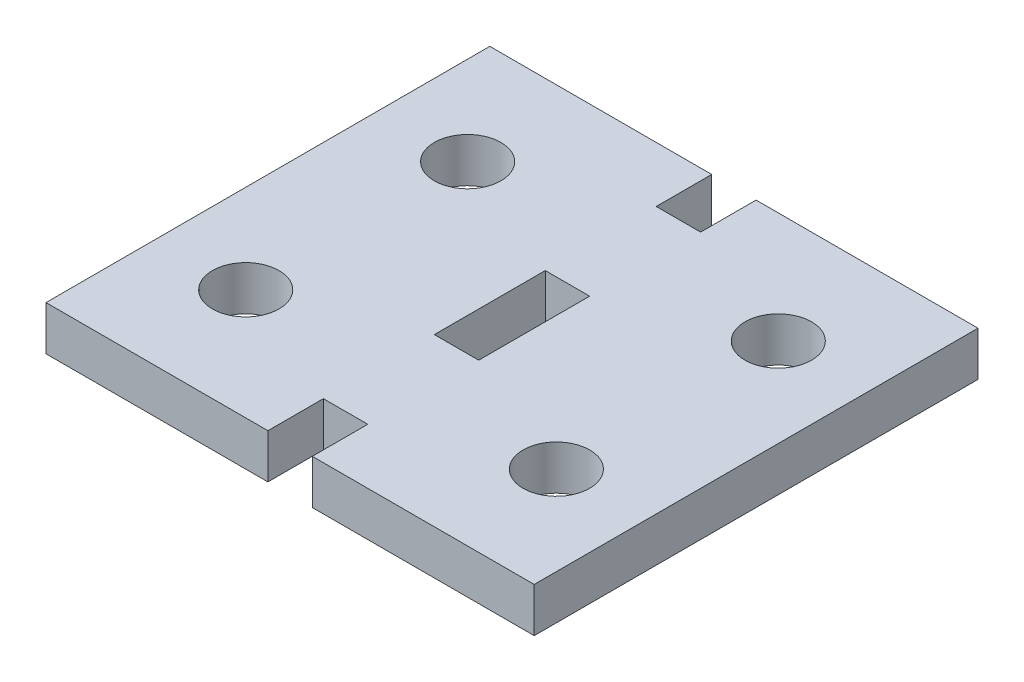
ISO-10303-21;
HEADER;
FILE_DESCRIPTION(('STEP AP214'),'2;1');
FILE_NAME('part.step','',(''),(''),'','','');
FILE_SCHEMA(('AUTOMOTIVE_DESIGN { 1 0 10303 214 1 1 1 1 }'));
ENDSEC;
DATA;
#1=APPLICATION_CONTEXT('core data for automotive mechanical design processes');
#2=APPLICATION_PROTOCOL_DEFINITION('international standard','automotive_design',2000,#1);
#3=PRODUCT_CONTEXT('',#1,'mechanical');
#4=PRODUCT('Part','Part','',(#3));
#5=PRODUCT_RELATED_PRODUCT_CATEGORY('part','',(#4));
#6=PRODUCT_DEFINITION_FORMATION('','',#4);
#7=PRODUCT_DEFINITION_CONTEXT('part definition',#1,'design');
#8=PRODUCT_DEFINITION('design','',#6,#7);
#9=PRODUCT_DEFINITION_SHAPE('','',#8);
#10=(LENGTH_UNIT() NAMED_UNIT(*) SI_UNIT(.MILLI.,.METRE.));
#11=(NAMED_UNIT(*) PLANE_ANGLE_UNIT() SI_UNIT($,.RADIAN.));
#12=(NAMED_UNIT(*) SI_UNIT($,.STERADIAN.) SOLID_ANGLE_UNIT());
#13=UNCERTAINTY_MEASURE_WITH_UNIT(LENGTH_MEASURE(1.E-05),#10,'distance_accuracy_value','');
#14=(GEOMETRIC_REPRESENTATION_CONTEXT(3) GLOBAL_UNCERTAINTY_ASSIGNED_CONTEXT((#13)) GLOBAL_UNIT_ASSIGNED_CONTEXT((#10,
#11,#12)) REPRESENTATION_CONTEXT('',''));
#15=CARTESIAN_POINT('',(0.,0.,0.));
#16=DIRECTION('',(0.,0.,1.));
#17=DIRECTION('',(1.,0.,0.));
#18=AXIS2_PLACEMENT_3D('',#15,#16,#17);
#19=CARTESIAN_POINT('',(-11.,2.,-10.));
#20=DIRECTION('',(0.,0.,1.));
#21=DIRECTION('',(1.,0.,0.));
#22=AXIS2_PLACEMENT_3D('',#19,#20,#21);
#23=PLANE('',#22);
#24=DIRECTION('',(-1.,0.,0.));
#25=VECTOR('',#24,1.);
#26=CARTESIAN_POINT('',(-11.,2.,-10.));
#27=LINE('',#26,#25);
#28=CARTESIAN_POINT('',(-1.,2.,-10.));
#29=VERTEX_POINT('',#28);
#30=CARTESIAN_POINT('',(-11.,2.,-10.));
#31=VERTEX_POINT('',#30);
#32=EDGE_CURVE('E253',#29,#31,#27,.T.);
#33=ORIENTED_EDGE('',*,*,#32,.F.);
#34=DIRECTION('',(0.,1.,0.));
#35=VECTOR('',#34,1.);
#36=CARTESIAN_POINT('',(-1.,0.,-10.));
#37=LINE('',#36,#35);
#38=CARTESIAN_POINT('',(-1.,0.,-10.));
#39=VERTEX_POINT('',#38);
#40=EDGE_CURVE('E181',#39,#29,#37,.T.);
#41=ORIENTED_EDGE('',*,*,#40,.F.);
#42=DIRECTION('',(-1.,0.,0.));
#43=VECTOR('',#42,1.);
#44=CARTESIAN_POINT('',(-11.,0.,-10.));
#45=LINE('',#44,#43);
#46=CARTESIAN_POINT('',(-11.,0.,-10.));
#47=VERTEX_POINT('',#46);
#48=EDGE_CURVE('E168',#39,#47,#45,.T.);
#49=ORIENTED_EDGE('',*,*,#48,.T.);
#50=DIRECTION('',(0.,-1.,0.));
#51=VECTOR('',#50,1.);
#52=CARTESIAN_POINT('',(-11.,2.,-10.));
#53=LINE('',#52,#51);
#54=EDGE_CURVE('E41',#31,#47,#53,.T.);
#55=ORIENTED_EDGE('',*,*,#54,.F.);
#56=EDGE_LOOP('',(#33,#41,#49,#55));
#57=FACE_BOUND('',#56,.T.);
#58=ADVANCED_FACE('F33',(#57),#23,.F.);
#59=CARTESIAN_POINT('',(-11.,2.,10.));
#60=DIRECTION('',(0.,0.,-1.));
#61=DIRECTION('',(-1.,0.,0.));
#62=AXIS2_PLACEMENT_3D('',#59,#60,#61);
#63=PLANE('',#62);
#64=DIRECTION('',(1.,0.,0.));
#65=VECTOR('',#64,1.);
#66=CARTESIAN_POINT('',(-11.,2.,10.));
#67=LINE('',#66,#65);
#68=CARTESIAN_POINT('',(1.,2.,10.));
#69=VERTEX_POINT('',#68);
#70=CARTESIAN_POINT('',(11.,2.,10.));
#71=VERTEX_POINT('',#70);
#72=EDGE_CURVE('E260',#69,#71,#67,.T.);
#73=ORIENTED_EDGE('',*,*,#72,.F.);
#74=DIRECTION('',(0.,1.,0.));
#75=VECTOR('',#74,1.);
#76=CARTESIAN_POINT('',(1.,0.,10.));
#77=LINE('',#76,#75);
#78=CARTESIAN_POINT('',(1.,0.,10.));
#79=VERTEX_POINT('',#78);
#80=EDGE_CURVE('E179',#79,#69,#77,.T.);
#81=ORIENTED_EDGE('',*,*,#80,.F.);
#82=DIRECTION('',(1.,0.,0.));
#83=VECTOR('',#82,1.);
#84=CARTESIAN_POINT('',(-11.,0.,10.));
#85=LINE('',#84,#83);
#86=CARTESIAN_POINT('',(11.,0.,10.));
#87=VERTEX_POINT('',#86);
#88=EDGE_CURVE('E272',#79,#87,#85,.T.);
#89=ORIENTED_EDGE('',*,*,#88,.T.);
#90=DIRECTION('',(0.,-1.,0.));
#91=VECTOR('',#90,1.);
#92=CARTESIAN_POINT('',(11.,2.,10.));
#93=LINE('',#92,#91);
#94=EDGE_CURVE('E264',#71,#87,#93,.T.);
#95=ORIENTED_EDGE('',*,*,#94,.F.);
#96=EDGE_LOOP('',(#73,#81,#89,#95));
#97=FACE_BOUND('',#96,.T.);
#98=ADVANCED_FACE('F298',(#97),#63,.F.);
#99=CARTESIAN_POINT('',(11.,2.,-10.));
#100=DIRECTION('',(-1.,0.,0.));
#101=DIRECTION('',(0.,0.,1.));
#102=AXIS2_PLACEMENT_3D('',#99,#100,#101);
#103=PLANE('',#102);
#104=DIRECTION('',(0.,0.,-1.));
#105=VECTOR('',#104,1.);
#106=CARTESIAN_POINT('',(11.,0.,-10.));
#107=LINE('',#106,#105);
#108=CARTESIAN_POINT('',(11.,0.,-10.));
#109=VERTEX_POINT('',#108);
#110=EDGE_CURVE('E243',#87,#109,#107,.T.);
#111=ORIENTED_EDGE('',*,*,#110,.T.);
#112=DIRECTION('',(0.,-1.,0.));
#113=VECTOR('',#112,1.);
#114=CARTESIAN_POINT('',(11.,2.,-10.));
#115=LINE('',#114,#113);
#116=CARTESIAN_POINT('',(11.,2.,-10.));
#117=VERTEX_POINT('',#116);
#118=EDGE_CURVE('E11',#117,#109,#115,.T.);
#119=ORIENTED_EDGE('',*,*,#118,.F.);
#120=DIRECTION('',(0.,0.,-1.));
#121=VECTOR('',#120,1.);
#122=CARTESIAN_POINT('',(11.,2.,-10.));
#123=LINE('',#122,#121);
#124=EDGE_CURVE('E250',#71,#117,#123,.T.);
#125=ORIENTED_EDGE('',*,*,#124,.F.);
#126=ORIENTED_EDGE('',*,*,#94,.T.);
#127=EDGE_LOOP('',(#111,#119,#125,#126));
#128=FACE_BOUND('',#127,.T.);
#129=ADVANCED_FACE('F35',(#128),#103,.F.);
#130=CARTESIAN_POINT('',(0.999999999999999,0.,-10.));
#131=VERTEX_POINT('',#130);
#132=EDGE_CURVE('E267',#109,#131,#45,.T.);
#133=ORIENTED_EDGE('',*,*,#132,.T.);
#134=DIRECTION('',(0.,1.,0.));
#135=VECTOR('',#134,1.);
#136=CARTESIAN_POINT('',(0.999999999999999,0.,-10.));
#137=LINE('',#136,#135);
#138=CARTESIAN_POINT('',(0.999999999999999,2.,-10.));
#139=VERTEX_POINT('',#138);
#140=EDGE_CURVE('E184',#131,#139,#137,.T.);
#141=ORIENTED_EDGE('',*,*,#140,.T.);
#142=EDGE_CURVE('E255',#117,#139,#27,.T.);
#143=ORIENTED_EDGE('',*,*,#142,.F.);
#144=ORIENTED_EDGE('',*,*,#118,.T.);
#145=EDGE_LOOP('',(#133,#141,#143,#144));
#146=FACE_BOUND('',#145,.T.);
#147=ADVANCED_FACE('F299',(#146),#23,.F.);
#148=CARTESIAN_POINT('',(-11.,2.,-10.));
#149=DIRECTION('',(1.,0.,0.));
#150=DIRECTION('',(0.,0.,-1.));
#151=AXIS2_PLACEMENT_3D('',#148,#149,#150);
#152=PLANE('',#151);
#153=DIRECTION('',(0.,0.,1.));
#154=VECTOR('',#153,1.);
#155=CARTESIAN_POINT('',(-11.,0.,-10.));
#156=LINE('',#155,#154);
#157=CARTESIAN_POINT('',(-11.,0.,10.));
#158=VERTEX_POINT('',#157);
#159=EDGE_CURVE('E270',#47,#158,#156,.T.);
#160=ORIENTED_EDGE('',*,*,#159,.T.);
#161=DIRECTION('',(0.,-1.,0.));
#162=VECTOR('',#161,1.);
#163=CARTESIAN_POINT('',(-11.,2.,10.));
#164=LINE('',#163,#162);
#165=CARTESIAN_POINT('',(-11.,2.,10.));
#166=VERTEX_POINT('',#165);
#167=EDGE_CURVE('E277',#166,#158,#164,.T.);
#168=ORIENTED_EDGE('',*,*,#167,.F.);
#169=DIRECTION('',(0.,0.,1.));
#170=VECTOR('',#169,1.);
#171=CARTESIAN_POINT('',(-11.,2.,-10.));
#172=LINE('',#171,#170);
#173=EDGE_CURVE('E258',#31,#166,#172,.T.);
#174=ORIENTED_EDGE('',*,*,#173,.F.);
#175=ORIENTED_EDGE('',*,*,#54,.T.);
#176=EDGE_LOOP('',(#160,#168,#174,#175));
#177=FACE_BOUND('',#176,.T.);
#178=ADVANCED_FACE('F283',(#177),#152,.F.);
#179=CARTESIAN_POINT('',(-0.999999999999998,0.,10.));
#180=VERTEX_POINT('',#179);
#181=EDGE_CURVE('E254',#158,#180,#85,.T.);
#182=ORIENTED_EDGE('',*,*,#181,.T.);
#183=DIRECTION('',(0.,1.,0.));
#184=VECTOR('',#183,1.);
#185=CARTESIAN_POINT('',(-0.999999999999998,0.,10.));
#186=LINE('',#185,#184);
#187=CARTESIAN_POINT('',(-0.999999999999998,2.,10.));
#188=VERTEX_POINT('',#187);
#189=EDGE_CURVE('E206',#180,#188,#186,.T.);
#190=ORIENTED_EDGE('',*,*,#189,.T.);
#191=EDGE_CURVE('E261',#166,#188,#67,.T.);
#192=ORIENTED_EDGE('',*,*,#191,.F.);
#193=ORIENTED_EDGE('',*,*,#167,.T.);
#194=EDGE_LOOP('',(#182,#190,#192,#193));
#195=FACE_BOUND('',#194,.T.);
#196=ADVANCED_FACE('F289',(#195),#63,.F.);
#197=CARTESIAN_POINT('',(0.,2.,0.));
#198=DIRECTION('',(0.,1.,0.));
#199=DIRECTION('',(0.,0.,1.));
#200=AXIS2_PLACEMENT_3D('',#197,#198,#199);
#201=PLANE('',#200);
#202=CARTESIAN_POINT('',(7.,2.,5.));
#203=DIRECTION('',(0.,1.,0.));
#204=DIRECTION('',(0.,0.,1.));
#205=AXIS2_PLACEMENT_3D('',#202,#203,#204);
#206=CIRCLE('',#205,1.5);
#207=CARTESIAN_POINT('',(7.,2.,6.5));
#208=VERTEX_POINT('',#207);
#209=EDGE_CURVE('E174',#208,#208,#206,.T.);
#210=ORIENTED_EDGE('',*,*,#209,.F.);
#211=EDGE_LOOP('',(#210));
#212=FACE_BOUND('',#211,.T.);
#213=CARTESIAN_POINT('',(7.,2.,-5.));
#214=DIRECTION('',(0.,1.,0.));
#215=DIRECTION('',(0.,0.,1.));
#216=AXIS2_PLACEMENT_3D('',#213,#214,#215);
#217=CIRCLE('',#216,1.5);
#218=CARTESIAN_POINT('',(7.,2.,-3.5));
#219=VERTEX_POINT('',#218);
#220=EDGE_CURVE('E467',#219,#219,#217,.T.);
#221=ORIENTED_EDGE('',*,*,#220,.F.);
#222=EDGE_LOOP('',(#221));
#223=FACE_BOUND('',#222,.T.);
#224=CARTESIAN_POINT('',(-7.,2.,5.));
#225=DIRECTION('',(0.,1.,0.));
#226=DIRECTION('',(0.,0.,1.));
#227=AXIS2_PLACEMENT_3D('',#224,#225,#226);
#228=CIRCLE('',#227,1.5);
#229=CARTESIAN_POINT('',(-7.,2.,6.5));
#230=VERTEX_POINT('',#229);
#231=EDGE_CURVE('E474',#230,#230,#228,.T.);
#232=ORIENTED_EDGE('',*,*,#231,.F.);
#233=EDGE_LOOP('',(#232));
#234=FACE_BOUND('',#233,.T.);
#235=CARTESIAN_POINT('',(-7.,2.,-5.));
#236=DIRECTION('',(0.,1.,0.));
#237=DIRECTION('',(0.,0.,1.));
#238=AXIS2_PLACEMENT_3D('',#235,#236,#237);
#239=CIRCLE('',#238,1.5);
#240=CARTESIAN_POINT('',(-7.,2.,-3.5));
#241=VERTEX_POINT('',#240);
#242=EDGE_CURVE('E214',#241,#241,#239,.T.);
#243=ORIENTED_EDGE('',*,*,#242,.F.);
#244=EDGE_LOOP('',(#243));
#245=FACE_BOUND('',#244,.T.);
#246=DIRECTION('',(0.,0.,-1.));
#247=VECTOR('',#246,1.);
#248=CARTESIAN_POINT('',(1.,2.,10.));
#249=LINE('',#248,#247);
#250=CARTESIAN_POINT('',(1.,2.,7.5));
#251=VERTEX_POINT('',#250);
#252=EDGE_CURVE('E197',#69,#251,#249,.T.);
#253=ORIENTED_EDGE('',*,*,#252,.F.);
#254=ORIENTED_EDGE('',*,*,#72,.T.);
#255=ORIENTED_EDGE('',*,*,#124,.T.);
#256=ORIENTED_EDGE('',*,*,#142,.T.);
#257=DIRECTION('',(0.,0.,-1.));
#258=VECTOR('',#257,1.);
#259=CARTESIAN_POINT('',(0.999999999999999,2.,-10.));
#260=LINE('',#259,#258);
#261=CARTESIAN_POINT('',(0.999999999999999,2.,-7.5));
#262=VERTEX_POINT('',#261);
#263=EDGE_CURVE('E169',#262,#139,#260,.T.);
#264=ORIENTED_EDGE('',*,*,#263,.F.);
#265=DIRECTION('',(1.,0.,0.));
#266=VECTOR('',#265,1.);
#267=CARTESIAN_POINT('',(-1.,2.,-7.5));
#268=LINE('',#267,#266);
#269=CARTESIAN_POINT('',(-1.,2.,-7.5));
#270=VERTEX_POINT('',#269);
#271=EDGE_CURVE('E171',#270,#262,#268,.T.);
#272=ORIENTED_EDGE('',*,*,#271,.F.);
#273=DIRECTION('',(0.,0.,1.));
#274=VECTOR('',#273,1.);
#275=CARTESIAN_POINT('',(-1.,2.,-7.5));
#276=LINE('',#275,#274);
#277=EDGE_CURVE('E152',#29,#270,#276,.T.);
#278=ORIENTED_EDGE('',*,*,#277,.F.);
#279=ORIENTED_EDGE('',*,*,#32,.T.);
#280=ORIENTED_EDGE('',*,*,#173,.T.);
#281=ORIENTED_EDGE('',*,*,#191,.T.);
#282=DIRECTION('',(0.,0.,1.));
#283=VECTOR('',#282,1.);
#284=CARTESIAN_POINT('',(-0.999999999999998,2.,7.5));
#285=LINE('',#284,#283);
#286=CARTESIAN_POINT('',(-0.999999999999998,2.,7.5));
#287=VERTEX_POINT('',#286);
#288=EDGE_CURVE('E192',#287,#188,#285,.T.);
#289=ORIENTED_EDGE('',*,*,#288,.F.);
#290=DIRECTION('',(-1.,0.,0.));
#291=VECTOR('',#290,1.);
#292=CARTESIAN_POINT('',(-0.999999999999998,2.,7.5));
#293=LINE('',#292,#291);
#294=EDGE_CURVE('E200',#251,#287,#293,.T.);
#295=ORIENTED_EDGE('',*,*,#294,.F.);
#296=EDGE_LOOP('',(#253,#254,#255,#256,#264,#272,#278,#279,#280,#281,#289,#295));
#297=FACE_BOUND('',#296,.T.);
#298=DIRECTION('',(0.,0.,-1.));
#299=VECTOR('',#298,1.);
#300=CARTESIAN_POINT('',(1.,2.,-2.5));
#301=LINE('',#300,#299);
#302=CARTESIAN_POINT('',(1.,2.,2.5));
#303=VERTEX_POINT('',#302);
#304=CARTESIAN_POINT('',(1.,2.,-2.5));
#305=VERTEX_POINT('',#304);
#306=EDGE_CURVE('E183',#303,#305,#301,.T.);
#307=ORIENTED_EDGE('',*,*,#306,.F.);
#308=DIRECTION('',(1.,0.,0.));
#309=VECTOR('',#308,1.);
#310=CARTESIAN_POINT('',(-0.999999999999999,2.,2.5));
#311=LINE('',#310,#309);
#312=CARTESIAN_POINT('',(-0.999999999999999,2.,2.5));
#313=VERTEX_POINT('',#312);
#314=EDGE_CURVE('E222',#313,#303,#311,.T.);
#315=ORIENTED_EDGE('',*,*,#314,.F.);
#316=DIRECTION('',(0.,0.,1.));
#317=VECTOR('',#316,1.);
#318=CARTESIAN_POINT('',(-1.,2.,-2.5));
#319=LINE('',#318,#317);
#320=CARTESIAN_POINT('',(-1.,2.,-2.5));
#321=VERTEX_POINT('',#320);
#322=EDGE_CURVE('E236',#321,#313,#319,.T.);
#323=ORIENTED_EDGE('',*,*,#322,.F.);
#324=DIRECTION('',(-1.,0.,0.));
#325=VECTOR('',#324,1.);
#326=CARTESIAN_POINT('',(-1.,2.,-2.5));
#327=LINE('',#326,#325);
#328=EDGE_CURVE('E233',#305,#321,#327,.T.);
#329=ORIENTED_EDGE('',*,*,#328,.F.);
#330=EDGE_LOOP('',(#307,#315,#323,#329));
#331=FACE_BOUND('',#330,.T.);
#332=ADVANCED_FACE('F294',(#212,#223,#234,#245,#297,#331),#201,.T.);
#333=CARTESIAN_POINT('',(0.,0.,0.));
#334=DIRECTION('',(0.,1.,0.));
#335=DIRECTION('',(0.,0.,1.));
#336=AXIS2_PLACEMENT_3D('',#333,#334,#335);
#337=PLANE('',#336);
#338=CARTESIAN_POINT('',(7.,0.,5.));
#339=DIRECTION('',(0.,1.,0.));
#340=DIRECTION('',(0.,0.,1.));
#341=AXIS2_PLACEMENT_3D('',#338,#339,#340);
#342=CIRCLE('',#341,1.5);
#343=CARTESIAN_POINT('',(7.,0.,6.5));
#344=VERTEX_POINT('',#343);
#345=EDGE_CURVE('E464',#344,#344,#342,.T.);
#346=ORIENTED_EDGE('',*,*,#345,.T.);
#347=EDGE_LOOP('',(#346));
#348=FACE_BOUND('',#347,.T.);
#349=CARTESIAN_POINT('',(7.,0.,-5.));
#350=DIRECTION('',(0.,1.,0.));
#351=DIRECTION('',(0.,0.,1.));
#352=AXIS2_PLACEMENT_3D('',#349,#350,#351);
#353=CIRCLE('',#352,1.5);
#354=CARTESIAN_POINT('',(7.,0.,-3.5));
#355=VERTEX_POINT('',#354);
#356=EDGE_CURVE('E469',#355,#355,#353,.T.);
#357=ORIENTED_EDGE('',*,*,#356,.T.);
#358=EDGE_LOOP('',(#357));
#359=FACE_BOUND('',#358,.T.);
#360=CARTESIAN_POINT('',(-7.,0.,5.));
#361=DIRECTION('',(0.,1.,0.));
#362=DIRECTION('',(0.,0.,1.));
#363=AXIS2_PLACEMENT_3D('',#360,#361,#362);
#364=CIRCLE('',#363,1.5);
#365=CARTESIAN_POINT('',(-7.,0.,6.5));
#366=VERTEX_POINT('',#365);
#367=EDGE_CURVE('E217',#366,#366,#364,.T.);
#368=ORIENTED_EDGE('',*,*,#367,.T.);
#369=EDGE_LOOP('',(#368));
#370=FACE_BOUND('',#369,.T.);
#371=CARTESIAN_POINT('',(-7.,0.,-5.));
#372=DIRECTION('',(0.,1.,0.));
#373=DIRECTION('',(0.,0.,1.));
#374=AXIS2_PLACEMENT_3D('',#371,#372,#373);
#375=CIRCLE('',#374,1.5);
#376=CARTESIAN_POINT('',(-7.,0.,-3.5));
#377=VERTEX_POINT('',#376);
#378=EDGE_CURVE('E201',#377,#377,#375,.T.);
#379=ORIENTED_EDGE('',*,*,#378,.T.);
#380=EDGE_LOOP('',(#379));
#381=FACE_BOUND('',#380,.T.);
#382=ORIENTED_EDGE('',*,*,#88,.F.);
#383=DIRECTION('',(0.,0.,-1.));
#384=VECTOR('',#383,1.);
#385=CARTESIAN_POINT('',(1.,0.,10.));
#386=LINE('',#385,#384);
#387=CARTESIAN_POINT('',(1.,0.,7.5));
#388=VERTEX_POINT('',#387);
#389=EDGE_CURVE('E188',#79,#388,#386,.T.);
#390=ORIENTED_EDGE('',*,*,#389,.T.);
#391=DIRECTION('',(-1.,0.,0.));
#392=VECTOR('',#391,1.);
#393=CARTESIAN_POINT('',(-0.999999999999998,0.,7.5));
#394=LINE('',#393,#392);
#395=CARTESIAN_POINT('',(-0.999999999999998,0.,7.5));
#396=VERTEX_POINT('',#395);
#397=EDGE_CURVE('E191',#388,#396,#394,.T.);
#398=ORIENTED_EDGE('',*,*,#397,.T.);
#399=DIRECTION('',(0.,0.,1.));
#400=VECTOR('',#399,1.);
#401=CARTESIAN_POINT('',(-0.999999999999998,0.,7.5));
#402=LINE('',#401,#400);
#403=EDGE_CURVE('E48',#396,#180,#402,.T.);
#404=ORIENTED_EDGE('',*,*,#403,.T.);
#405=ORIENTED_EDGE('',*,*,#181,.F.);
#406=ORIENTED_EDGE('',*,*,#159,.F.);
#407=ORIENTED_EDGE('',*,*,#48,.F.);
#408=DIRECTION('',(0.,0.,1.));
#409=VECTOR('',#408,1.);
#410=CARTESIAN_POINT('',(-1.,0.,-7.5));
#411=LINE('',#410,#409);
#412=CARTESIAN_POINT('',(-1.,0.,-7.5));
#413=VERTEX_POINT('',#412);
#414=EDGE_CURVE('E149',#39,#413,#411,.T.);
#415=ORIENTED_EDGE('',*,*,#414,.T.);
#416=DIRECTION('',(1.,0.,0.));
#417=VECTOR('',#416,1.);
#418=CARTESIAN_POINT('',(-1.,0.,-7.5));
#419=LINE('',#418,#417);
#420=CARTESIAN_POINT('',(0.999999999999999,0.,-7.5));
#421=VERTEX_POINT('',#420);
#422=EDGE_CURVE('E159',#413,#421,#419,.T.);
#423=ORIENTED_EDGE('',*,*,#422,.T.);
#424=DIRECTION('',(0.,0.,-1.));
#425=VECTOR('',#424,1.);
#426=CARTESIAN_POINT('',(0.999999999999999,0.,-10.));
#427=LINE('',#426,#425);
#428=EDGE_CURVE('E56',#421,#131,#427,.T.);
#429=ORIENTED_EDGE('',*,*,#428,.T.);
#430=ORIENTED_EDGE('',*,*,#132,.F.);
#431=ORIENTED_EDGE('',*,*,#110,.F.);
#432=EDGE_LOOP('',(#382,#390,#398,#404,#405,#406,#407,#415,#423,#429,#430,#431));
#433=FACE_BOUND('',#432,.T.);
#434=DIRECTION('',(1.,0.,0.));
#435=VECTOR('',#434,1.);
#436=CARTESIAN_POINT('',(-0.999999999999999,0.,2.5));
#437=LINE('',#436,#435);
#438=CARTESIAN_POINT('',(-0.999999999999999,0.,2.5));
#439=VERTEX_POINT('',#438);
#440=CARTESIAN_POINT('',(1.,0.,2.5));
#441=VERTEX_POINT('',#440);
#442=EDGE_CURVE('E228',#439,#441,#437,.T.);
#443=ORIENTED_EDGE('',*,*,#442,.T.);
#444=DIRECTION('',(0.,0.,-1.));
#445=VECTOR('',#444,1.);
#446=CARTESIAN_POINT('',(1.,0.,-2.5));
#447=LINE('',#446,#445);
#448=CARTESIAN_POINT('',(1.,0.,-2.5));
#449=VERTEX_POINT('',#448);
#450=EDGE_CURVE('E218',#441,#449,#447,.T.);
#451=ORIENTED_EDGE('',*,*,#450,.T.);
#452=DIRECTION('',(-1.,0.,0.));
#453=VECTOR('',#452,1.);
#454=CARTESIAN_POINT('',(-1.,0.,-2.5));
#455=LINE('',#454,#453);
#456=CARTESIAN_POINT('',(-1.,0.,-2.5));
#457=VERTEX_POINT('',#456);
#458=EDGE_CURVE('E221',#449,#457,#455,.T.);
#459=ORIENTED_EDGE('',*,*,#458,.T.);
#460=DIRECTION('',(0.,0.,1.));
#461=VECTOR('',#460,1.);
#462=CARTESIAN_POINT('',(-1.,0.,-2.5));
#463=LINE('',#462,#461);
#464=EDGE_CURVE('E225',#457,#439,#463,.T.);
#465=ORIENTED_EDGE('',*,*,#464,.T.);
#466=EDGE_LOOP('',(#443,#451,#459,#465));
#467=FACE_BOUND('',#466,.T.);
#468=ADVANCED_FACE('F165',(#348,#359,#370,#381,#433,#467),#337,.F.);
#469=CARTESIAN_POINT('',(1.,0.,-2.5));
#470=DIRECTION('',(1.,0.,0.));
#471=DIRECTION('',(0.,0.,-1.));
#472=AXIS2_PLACEMENT_3D('',#469,#470,#471);
#473=PLANE('',#472);
#474=ORIENTED_EDGE('',*,*,#306,.T.);
#475=DIRECTION('',(0.,1.,0.));
#476=VECTOR('',#475,1.);
#477=CARTESIAN_POINT('',(1.,0.,-2.5));
#478=LINE('',#477,#476);
#479=EDGE_CURVE('E231',#449,#305,#478,.T.);
#480=ORIENTED_EDGE('',*,*,#479,.F.);
#481=ORIENTED_EDGE('',*,*,#450,.F.);
#482=DIRECTION('',(0.,1.,0.));
#483=VECTOR('',#482,1.);
#484=CARTESIAN_POINT('',(1.,0.,2.5));
#485=LINE('',#484,#483);
#486=EDGE_CURVE('E241',#441,#303,#485,.T.);
#487=ORIENTED_EDGE('',*,*,#486,.T.);
#488=EDGE_LOOP('',(#474,#480,#481,#487));
#489=FACE_BOUND('',#488,.T.);
#490=ADVANCED_FACE('F345',(#489),#473,.F.);
#491=CARTESIAN_POINT('',(-0.999999999999999,0.,2.5));
#492=DIRECTION('',(0.,0.,1.));
#493=DIRECTION('',(1.,0.,0.));
#494=AXIS2_PLACEMENT_3D('',#491,#492,#493);
#495=PLANE('',#494);
#496=ORIENTED_EDGE('',*,*,#314,.T.);
#497=ORIENTED_EDGE('',*,*,#486,.F.);
#498=ORIENTED_EDGE('',*,*,#442,.F.);
#499=DIRECTION('',(0.,1.,0.));
#500=VECTOR('',#499,1.);
#501=CARTESIAN_POINT('',(-0.999999999999999,0.,2.5));
#502=LINE('',#501,#500);
#503=EDGE_CURVE('E244',#439,#313,#502,.T.);
#504=ORIENTED_EDGE('',*,*,#503,.T.);
#505=EDGE_LOOP('',(#496,#497,#498,#504));
#506=FACE_BOUND('',#505,.T.);
#507=ADVANCED_FACE('F341',(#506),#495,.F.);
#508=CARTESIAN_POINT('',(-1.,0.,-2.5));
#509=DIRECTION('',(-1.,0.,0.));
#510=DIRECTION('',(0.,0.,1.));
#511=AXIS2_PLACEMENT_3D('',#508,#509,#510);
#512=PLANE('',#511);
#513=ORIENTED_EDGE('',*,*,#322,.T.);
#514=ORIENTED_EDGE('',*,*,#503,.F.);
#515=ORIENTED_EDGE('',*,*,#464,.F.);
#516=DIRECTION('',(0.,1.,0.));
#517=VECTOR('',#516,1.);
#518=CARTESIAN_POINT('',(-1.,0.,-2.5));
#519=LINE('',#518,#517);
#520=EDGE_CURVE('E246',#457,#321,#519,.T.);
#521=ORIENTED_EDGE('',*,*,#520,.T.);
#522=EDGE_LOOP('',(#513,#514,#515,#521));
#523=FACE_BOUND('',#522,.T.);
#524=ADVANCED_FACE('F344',(#523),#512,.F.);
#525=CARTESIAN_POINT('',(-1.,0.,-2.5));
#526=DIRECTION('',(0.,0.,-1.));
#527=DIRECTION('',(-1.,0.,0.));
#528=AXIS2_PLACEMENT_3D('',#525,#526,#527);
#529=PLANE('',#528);
#530=ORIENTED_EDGE('',*,*,#328,.T.);
#531=ORIENTED_EDGE('',*,*,#520,.F.);
#532=ORIENTED_EDGE('',*,*,#458,.F.);
#533=ORIENTED_EDGE('',*,*,#479,.T.);
#534=EDGE_LOOP('',(#530,#531,#532,#533));
#535=FACE_BOUND('',#534,.T.);
#536=ADVANCED_FACE('F349',(#535),#529,.F.);
#537=CARTESIAN_POINT('',(-1.,0.,-7.5));
#538=DIRECTION('',(-1.,0.,0.));
#539=DIRECTION('',(0.,0.,1.));
#540=AXIS2_PLACEMENT_3D('',#537,#538,#539);
#541=PLANE('',#540);
#542=ORIENTED_EDGE('',*,*,#277,.T.);
#543=DIRECTION('',(0.,1.,0.));
#544=VECTOR('',#543,1.);
#545=CARTESIAN_POINT('',(-1.,0.,-7.5));
#546=LINE('',#545,#544);
#547=EDGE_CURVE('E145',#413,#270,#546,.T.);
#548=ORIENTED_EDGE('',*,*,#547,.F.);
#549=ORIENTED_EDGE('',*,*,#414,.F.);
#550=ORIENTED_EDGE('',*,*,#40,.T.);
#551=EDGE_LOOP('',(#542,#548,#549,#550));
#552=FACE_BOUND('',#551,.T.);
#553=ADVANCED_FACE('F147',(#552),#541,.F.);
#554=CARTESIAN_POINT('',(0.999999999999999,0.,-10.));
#555=DIRECTION('',(1.,0.,0.));
#556=DIRECTION('',(0.,0.,-1.));
#557=AXIS2_PLACEMENT_3D('',#554,#555,#556);
#558=PLANE('',#557);
#559=ORIENTED_EDGE('',*,*,#263,.T.);
#560=ORIENTED_EDGE('',*,*,#140,.F.);
#561=ORIENTED_EDGE('',*,*,#428,.F.);
#562=DIRECTION('',(0.,1.,0.));
#563=VECTOR('',#562,1.);
#564=CARTESIAN_POINT('',(0.999999999999999,0.,-7.5));
#565=LINE('',#564,#563);
#566=EDGE_CURVE('E156',#421,#262,#565,.T.);
#567=ORIENTED_EDGE('',*,*,#566,.T.);
#568=EDGE_LOOP('',(#559,#560,#561,#567));
#569=FACE_BOUND('',#568,.T.);
#570=ADVANCED_FACE('F397',(#569),#558,.F.);
#571=CARTESIAN_POINT('',(-1.,0.,-7.5));
#572=DIRECTION('',(0.,0.,1.));
#573=DIRECTION('',(1.,0.,0.));
#574=AXIS2_PLACEMENT_3D('',#571,#572,#573);
#575=PLANE('',#574);
#576=ORIENTED_EDGE('',*,*,#271,.T.);
#577=ORIENTED_EDGE('',*,*,#566,.F.);
#578=ORIENTED_EDGE('',*,*,#422,.F.);
#579=ORIENTED_EDGE('',*,*,#547,.T.);
#580=EDGE_LOOP('',(#576,#577,#578,#579));
#581=FACE_BOUND('',#580,.T.);
#582=ADVANCED_FACE('F160',(#581),#575,.F.);
#583=CARTESIAN_POINT('',(1.,0.,10.));
#584=DIRECTION('',(1.,0.,0.));
#585=DIRECTION('',(0.,0.,-1.));
#586=AXIS2_PLACEMENT_3D('',#583,#584,#585);
#587=PLANE('',#586);
#588=ORIENTED_EDGE('',*,*,#252,.T.);
#589=DIRECTION('',(0.,1.,0.));
#590=VECTOR('',#589,1.);
#591=CARTESIAN_POINT('',(1.,0.,7.5));
#592=LINE('',#591,#590);
#593=EDGE_CURVE('E196',#388,#251,#592,.T.);
#594=ORIENTED_EDGE('',*,*,#593,.F.);
#595=ORIENTED_EDGE('',*,*,#389,.F.);
#596=ORIENTED_EDGE('',*,*,#80,.T.);
#597=EDGE_LOOP('',(#588,#594,#595,#596));
#598=FACE_BOUND('',#597,.T.);
#599=ADVANCED_FACE('F320',(#598),#587,.F.);
#600=CARTESIAN_POINT('',(-0.999999999999998,0.,7.5));
#601=DIRECTION('',(-1.,0.,0.));
#602=DIRECTION('',(0.,0.,1.));
#603=AXIS2_PLACEMENT_3D('',#600,#601,#602);
#604=PLANE('',#603);
#605=ORIENTED_EDGE('',*,*,#288,.T.);
#606=ORIENTED_EDGE('',*,*,#189,.F.);
#607=ORIENTED_EDGE('',*,*,#403,.F.);
#608=DIRECTION('',(0.,1.,0.));
#609=VECTOR('',#608,1.);
#610=CARTESIAN_POINT('',(-0.999999999999998,0.,7.5));
#611=LINE('',#610,#609);
#612=EDGE_CURVE('E209',#396,#287,#611,.T.);
#613=ORIENTED_EDGE('',*,*,#612,.T.);
#614=EDGE_LOOP('',(#605,#606,#607,#613));
#615=FACE_BOUND('',#614,.T.);
#616=ADVANCED_FACE('F324',(#615),#604,.F.);
#617=CARTESIAN_POINT('',(-0.999999999999998,0.,7.5));
#618=DIRECTION('',(0.,0.,-1.));
#619=DIRECTION('',(-1.,0.,0.));
#620=AXIS2_PLACEMENT_3D('',#617,#618,#619);
#621=PLANE('',#620);
#622=ORIENTED_EDGE('',*,*,#294,.T.);
#623=ORIENTED_EDGE('',*,*,#612,.F.);
#624=ORIENTED_EDGE('',*,*,#397,.F.);
#625=ORIENTED_EDGE('',*,*,#593,.T.);
#626=EDGE_LOOP('',(#622,#623,#624,#625));
#627=FACE_BOUND('',#626,.T.);
#628=ADVANCED_FACE('F322',(#627),#621,.F.);
#629=CARTESIAN_POINT('',(-7.,0.,-5.));
#630=DIRECTION('',(0.,1.,0.));
#631=DIRECTION('',(0.,0.,1.));
#632=AXIS2_PLACEMENT_3D('',#629,#630,#631);
#633=CYLINDRICAL_SURFACE('',#632,1.5);
#634=ORIENTED_EDGE('',*,*,#378,.F.);
#635=EDGE_LOOP('',(#634));
#636=FACE_BOUND('',#635,.T.);
#637=ORIENTED_EDGE('',*,*,#242,.T.);
#638=EDGE_LOOP('',(#637));
#639=FACE_BOUND('',#638,.T.);
#640=ADVANCED_FACE('F331',(#636,#639),#633,.F.);
#641=CARTESIAN_POINT('',(-7.,0.,5.));
#642=DIRECTION('',(0.,1.,0.));
#643=DIRECTION('',(0.,0.,1.));
#644=AXIS2_PLACEMENT_3D('',#641,#642,#643);
#645=CYLINDRICAL_SURFACE('',#644,1.5);
#646=ORIENTED_EDGE('',*,*,#367,.F.);
#647=EDGE_LOOP('',(#646));
#648=FACE_BOUND('',#647,.T.);
#649=ORIENTED_EDGE('',*,*,#231,.T.);
#650=EDGE_LOOP('',(#649));
#651=FACE_BOUND('',#650,.T.);
#652=ADVANCED_FACE('F339',(#648,#651),#645,.F.);
#653=CARTESIAN_POINT('',(7.,0.,-5.));
#654=DIRECTION('',(0.,1.,0.));
#655=DIRECTION('',(0.,0.,1.));
#656=AXIS2_PLACEMENT_3D('',#653,#654,#655);
#657=CYLINDRICAL_SURFACE('',#656,1.5);
#658=ORIENTED_EDGE('',*,*,#356,.F.);
#659=EDGE_LOOP('',(#658));
#660=FACE_BOUND('',#659,.T.);
#661=ORIENTED_EDGE('',*,*,#220,.T.);
#662=EDGE_LOOP('',(#661));
#663=FACE_BOUND('',#662,.T.);
#664=ADVANCED_FACE('F437',(#660,#663),#657,.F.);
#665=CARTESIAN_POINT('',(7.,0.,5.));
#666=DIRECTION('',(0.,1.,0.));
#667=DIRECTION('',(0.,0.,1.));
#668=AXIS2_PLACEMENT_3D('',#665,#666,#667);
#669=CYLINDRICAL_SURFACE('',#668,1.5);
#670=ORIENTED_EDGE('',*,*,#345,.F.);
#671=EDGE_LOOP('',(#670));
#672=FACE_BOUND('',#671,.T.);
#673=ORIENTED_EDGE('',*,*,#209,.T.);
#674=EDGE_LOOP('',(#673));
#675=FACE_BOUND('',#674,.T.);
#676=ADVANCED_FACE('F447',(#672,#675),#669,.F.);
#677=CLOSED_SHELL('',(#58,#98,#129,#147,#178,#196,#332,#468,#490,#507,#524,#536,#553,#570,#582,
#599,#616,#628,#640,#652,#664,#676));
#678=MANIFOLD_SOLID_BREP('B2',#677);
#679=ADVANCED_BREP_SHAPE_REPRESENTATION('',(#18,#678),#14);
#680=SHAPE_DEFINITION_REPRESENTATION(#9,#679);
ENDSEC;
END-ISO-10303-21;
